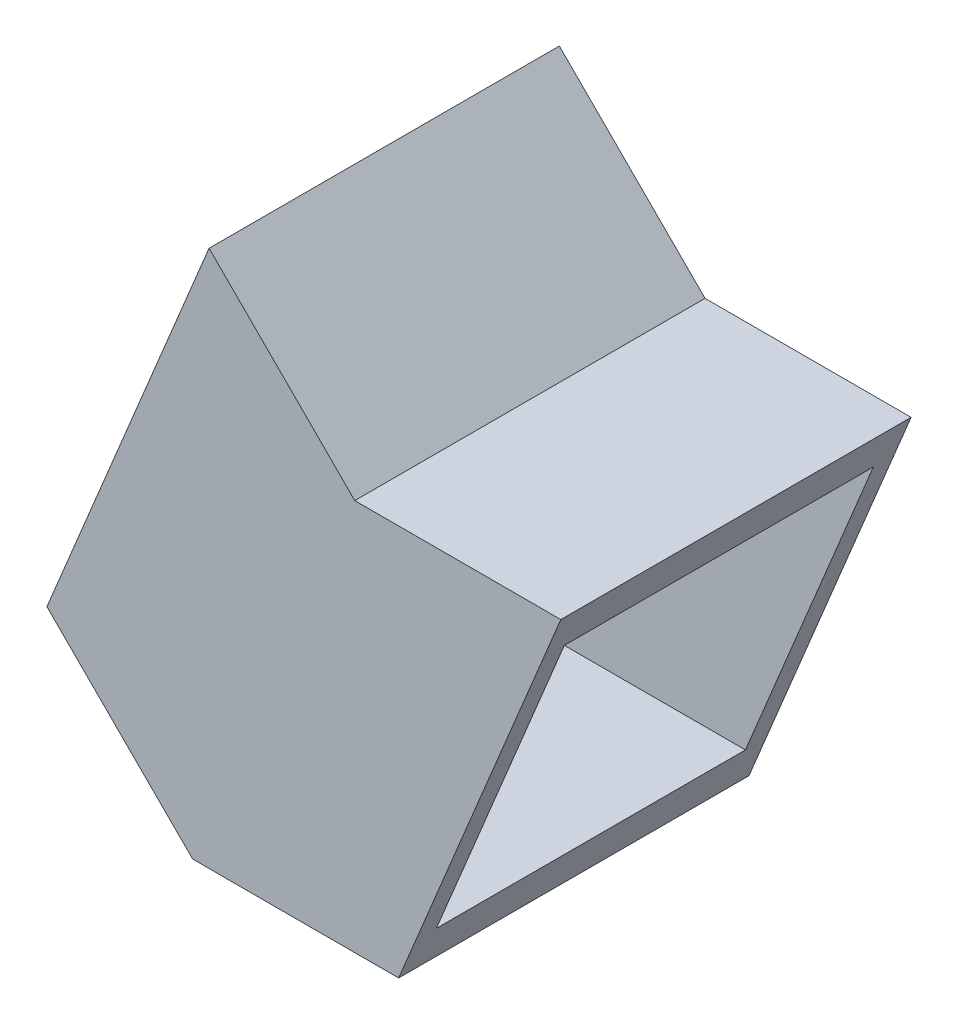
ISO-10303-21;
HEADER;
FILE_DESCRIPTION(('STEP AP214'),'2;1');
FILE_NAME('part.step','',(''),(''),'','','');
FILE_SCHEMA(('AUTOMOTIVE_DESIGN { 1 0 10303 214 1 1 1 1 }'));
ENDSEC;
DATA;
#1=APPLICATION_CONTEXT('core data for automotive mechanical design processes');
#2=APPLICATION_PROTOCOL_DEFINITION('international standard','automotive_design',2000,#1);
#3=PRODUCT_CONTEXT('',#1,'mechanical');
#4=PRODUCT('Part','Part','',(#3));
#5=PRODUCT_RELATED_PRODUCT_CATEGORY('part','',(#4));
#6=PRODUCT_DEFINITION_FORMATION('','',#4);
#7=PRODUCT_DEFINITION_CONTEXT('part definition',#1,'design');
#8=PRODUCT_DEFINITION('design','',#6,#7);
#9=PRODUCT_DEFINITION_SHAPE('','',#8);
#10=(LENGTH_UNIT() NAMED_UNIT(*) SI_UNIT(.MILLI.,.METRE.));
#11=(NAMED_UNIT(*) PLANE_ANGLE_UNIT() SI_UNIT($,.RADIAN.));
#12=(NAMED_UNIT(*) SI_UNIT($,.STERADIAN.) SOLID_ANGLE_UNIT());
#13=UNCERTAINTY_MEASURE_WITH_UNIT(LENGTH_MEASURE(1.E-05),#10,'distance_accuracy_value','');
#14=(GEOMETRIC_REPRESENTATION_CONTEXT(3) GLOBAL_UNCERTAINTY_ASSIGNED_CONTEXT((#13)) GLOBAL_UNIT_ASSIGNED_CONTEXT((#10,
#11,#12)) REPRESENTATION_CONTEXT('',''));
#15=CARTESIAN_POINT('',(0.,0.,0.));
#16=DIRECTION('',(0.,0.,1.));
#17=DIRECTION('',(1.,0.,0.));
#18=AXIS2_PLACEMENT_3D('',#15,#16,#17);
#19=CARTESIAN_POINT('',(-91.9238815542513,-91.9238815542513,34.));
#20=DIRECTION('',(0.707106781186547,0.707106781186547,0.));
#21=DIRECTION('',(-0.707106781186548,0.707106781186548,0.));
#22=AXIS2_PLACEMENT_3D('',#19,#20,#21);
#23=PLANE('',#22);
#24=DIRECTION('',(0.707106781186548,-0.707106781186548,0.));
#25=VECTOR('',#24,1.);
#26=CARTESIAN_POINT('',(-91.9238815542513,-91.9238815542513,2.));
#27=LINE('',#26,#25);
#28=CARTESIAN_POINT('',(-67.9898987322334,-115.857864376269,2.));
#29=VERTEX_POINT('',#28);
#30=CARTESIAN_POINT('',(-53.8477631085024,-130.,2.));
#31=VERTEX_POINT('',#30);
#32=EDGE_CURVE('E238',#29,#31,#27,.T.);
#33=ORIENTED_EDGE('',*,*,#32,.F.);
#34=DIRECTION('',(0.,0.,-1.));
#35=VECTOR('',#34,1.);
#36=CARTESIAN_POINT('',(-67.9898987322334,-115.857864376269,-0.001000000000001));
#37=LINE('',#36,#35);
#38=CARTESIAN_POINT('',(-67.9898987322334,-115.857864376269,32.));
#39=VERTEX_POINT('',#38);
#40=EDGE_CURVE('E222',#39,#29,#37,.T.);
#41=ORIENTED_EDGE('',*,*,#40,.F.);
#42=DIRECTION('',(-0.707106781186548,0.707106781186548,0.));
#43=VECTOR('',#42,1.);
#44=CARTESIAN_POINT('',(-91.9238815542513,-91.9238815542513,32.));
#45=LINE('',#44,#43);
#46=CARTESIAN_POINT('',(-53.8477631085024,-130.,32.));
#47=VERTEX_POINT('',#46);
#48=EDGE_CURVE('E236',#47,#39,#45,.T.);
#49=ORIENTED_EDGE('',*,*,#48,.F.);
#50=DIRECTION('',(0.,0.,-1.));
#51=VECTOR('',#50,1.);
#52=CARTESIAN_POINT('',(-53.8477631085024,-130.,34.));
#53=LINE('',#52,#51);
#54=EDGE_CURVE('E135',#47,#31,#53,.T.);
#55=ORIENTED_EDGE('',*,*,#54,.T.);
#56=EDGE_LOOP('',(#33,#41,#49,#55));
#57=FACE_BOUND('',#56,.T.);
#58=ADVANCED_FACE('F131',(#57),#23,.T.);
#59=CARTESIAN_POINT('',(0.,0.,2.));
#60=DIRECTION('',(0.,0.,1.));
#61=DIRECTION('',(1.,0.,0.));
#62=AXIS2_PLACEMENT_3D('',#59,#60,#61);
#63=PLANE('',#62);
#64=DIRECTION('',(0.707106781186548,-0.707106781186548,0.));
#65=VECTOR('',#64,1.);
#66=CARTESIAN_POINT('',(-70.7106781186548,-70.7106781186548,2.));
#67=LINE('',#66,#65);
#68=CARTESIAN_POINT('',(-55.5634918610405,-85.8578643762691,2.));
#69=VERTEX_POINT('',#68);
#70=CARTESIAN_POINT('',(-41.4213562373096,-100.,2.));
#71=VERTEX_POINT('',#70);
#72=EDGE_CURVE('E270',#69,#71,#67,.T.);
#73=ORIENTED_EDGE('',*,*,#72,.F.);
#74=DIRECTION('',(0.382683432365089,0.923879532511287,0.));
#75=VECTOR('',#74,1.);
#76=CARTESIAN_POINT('',(-17.0710678118656,7.07106781186552,2.));
#77=LINE('',#76,#75);
#78=EDGE_CURVE('E230',#29,#69,#77,.T.);
#79=ORIENTED_EDGE('',*,*,#78,.F.);
#80=ORIENTED_EDGE('',*,*,#32,.T.);
#81=DIRECTION('',(1.,0.,0.));
#82=VECTOR('',#81,1.);
#83=CARTESIAN_POINT('',(0.,-130.,2.));
#84=LINE('',#83,#82);
#85=CARTESIAN_POINT('',(-33.8477631085024,-130.,2.));
#86=VERTEX_POINT('',#85);
#87=EDGE_CURVE('E273',#31,#86,#84,.T.);
#88=ORIENTED_EDGE('',*,*,#87,.T.);
#89=DIRECTION('',(0.382683432365089,0.923879532511287,0.));
#90=VECTOR('',#89,1.);
#91=CARTESIAN_POINT('',(17.0710678118654,-7.07106781186542,2.));
#92=LINE('',#91,#90);
#93=CARTESIAN_POINT('',(-21.4213562373096,-100.,2.));
#94=VERTEX_POINT('',#93);
#95=EDGE_CURVE('E301',#86,#94,#92,.T.);
#96=ORIENTED_EDGE('',*,*,#95,.T.);
#97=DIRECTION('',(1.,0.,0.));
#98=VECTOR('',#97,1.);
#99=CARTESIAN_POINT('',(0.,-100.,2.));
#100=LINE('',#99,#98);
#101=EDGE_CURVE('E265',#71,#94,#100,.T.);
#102=ORIENTED_EDGE('',*,*,#101,.F.);
#103=EDGE_LOOP('',(#73,#79,#80,#88,#96,#102));
#104=FACE_BOUND('',#103,.T.);
#105=ADVANCED_FACE('F315',(#104),#63,.T.);
#106=CARTESIAN_POINT('',(-70.7106781186548,-70.7106781186548,34.));
#107=DIRECTION('',(0.707106781186547,0.707106781186547,0.));
#108=DIRECTION('',(-0.707106781186548,0.707106781186548,0.));
#109=AXIS2_PLACEMENT_3D('',#106,#107,#108);
#110=PLANE('',#109);
#111=DIRECTION('',(0.,0.,-1.));
#112=VECTOR('',#111,1.);
#113=CARTESIAN_POINT('',(-55.5634918610405,-85.8578643762691,-0.001000000000001));
#114=LINE('',#113,#112);
#115=CARTESIAN_POINT('',(-55.5634918610405,-85.8578643762691,32.));
#116=VERTEX_POINT('',#115);
#117=EDGE_CURVE('E225',#116,#69,#114,.T.);
#118=ORIENTED_EDGE('',*,*,#117,.T.);
#119=ORIENTED_EDGE('',*,*,#72,.T.);
#120=DIRECTION('',(0.,0.,-1.));
#121=VECTOR('',#120,1.);
#122=CARTESIAN_POINT('',(-41.4213562373096,-100.,34.));
#123=LINE('',#122,#121);
#124=CARTESIAN_POINT('',(-41.4213562373096,-100.,32.));
#125=VERTEX_POINT('',#124);
#126=EDGE_CURVE('E262',#125,#71,#123,.T.);
#127=ORIENTED_EDGE('',*,*,#126,.F.);
#128=DIRECTION('',(-0.707106781186548,0.707106781186548,0.));
#129=VECTOR('',#128,1.);
#130=CARTESIAN_POINT('',(-70.7106781186548,-70.7106781186548,32.));
#131=LINE('',#130,#129);
#132=EDGE_CURVE('E245',#125,#116,#131,.T.);
#133=ORIENTED_EDGE('',*,*,#132,.T.);
#134=EDGE_LOOP('',(#118,#119,#127,#133));
#135=FACE_BOUND('',#134,.T.);
#136=ADVANCED_FACE('F312',(#135),#110,.F.);
#137=CARTESIAN_POINT('',(0.,0.,32.));
#138=DIRECTION('',(0.,0.,-1.));
#139=DIRECTION('',(-1.,0.,0.));
#140=AXIS2_PLACEMENT_3D('',#137,#138,#139);
#141=PLANE('',#140);
#142=ORIENTED_EDGE('',*,*,#48,.T.);
#143=DIRECTION('',(-0.382683432365089,-0.923879532511287,0.));
#144=VECTOR('',#143,1.);
#145=CARTESIAN_POINT('',(-17.0710678118656,7.07106781186552,32.));
#146=LINE('',#145,#144);
#147=EDGE_CURVE('E219',#116,#39,#146,.T.);
#148=ORIENTED_EDGE('',*,*,#147,.F.);
#149=ORIENTED_EDGE('',*,*,#132,.F.);
#150=DIRECTION('',(-1.,0.,0.));
#151=VECTOR('',#150,1.);
#152=CARTESIAN_POINT('',(0.,-100.,32.));
#153=LINE('',#152,#151);
#154=CARTESIAN_POINT('',(-21.4213562373096,-100.,32.));
#155=VERTEX_POINT('',#154);
#156=EDGE_CURVE('E239',#155,#125,#153,.T.);
#157=ORIENTED_EDGE('',*,*,#156,.F.);
#158=DIRECTION('',(-0.382683432365089,-0.923879532511287,0.));
#159=VECTOR('',#158,1.);
#160=CARTESIAN_POINT('',(17.0710678118654,-7.07106781186542,32.));
#161=LINE('',#160,#159);
#162=CARTESIAN_POINT('',(-33.8477631085024,-130.,32.));
#163=VERTEX_POINT('',#162);
#164=EDGE_CURVE('E319',#155,#163,#161,.T.);
#165=ORIENTED_EDGE('',*,*,#164,.T.);
#166=DIRECTION('',(-1.,0.,0.));
#167=VECTOR('',#166,1.);
#168=CARTESIAN_POINT('',(0.,-130.,32.));
#169=LINE('',#168,#167);
#170=EDGE_CURVE('E244',#163,#47,#169,.T.);
#171=ORIENTED_EDGE('',*,*,#170,.T.);
#172=EDGE_LOOP('',(#142,#148,#149,#157,#165,#171));
#173=FACE_BOUND('',#172,.T.);
#174=ADVANCED_FACE('F241',(#173),#141,.T.);
#175=CARTESIAN_POINT('',(0.,-130.,34.));
#176=DIRECTION('',(0.,1.,0.));
#177=DIRECTION('',(0.,0.,1.));
#178=AXIS2_PLACEMENT_3D('',#175,#176,#177);
#179=PLANE('',#178);
#180=DIRECTION('',(0.,0.,-1.));
#181=VECTOR('',#180,1.);
#182=CARTESIAN_POINT('',(-33.8477631085024,-130.,-0.001000000000001));
#183=LINE('',#182,#181);
#184=EDGE_CURVE('E297',#163,#86,#183,.T.);
#185=ORIENTED_EDGE('',*,*,#184,.T.);
#186=ORIENTED_EDGE('',*,*,#87,.F.);
#187=ORIENTED_EDGE('',*,*,#54,.F.);
#188=ORIENTED_EDGE('',*,*,#170,.F.);
#189=EDGE_LOOP('',(#185,#186,#187,#188));
#190=FACE_BOUND('',#189,.T.);
#191=ADVANCED_FACE('F133',(#190),#179,.T.);
#192=CARTESIAN_POINT('',(0.,-100.,34.));
#193=DIRECTION('',(0.,1.,0.));
#194=DIRECTION('',(-1.,0.,0.));
#195=AXIS2_PLACEMENT_3D('',#192,#193,#194);
#196=PLANE('',#195);
#197=ORIENTED_EDGE('',*,*,#101,.T.);
#198=DIRECTION('',(0.,0.,-1.));
#199=VECTOR('',#198,1.);
#200=CARTESIAN_POINT('',(-21.4213562373096,-100.,-0.001000000000001));
#201=LINE('',#200,#199);
#202=EDGE_CURVE('E310',#155,#94,#201,.T.);
#203=ORIENTED_EDGE('',*,*,#202,.F.);
#204=ORIENTED_EDGE('',*,*,#156,.T.);
#205=ORIENTED_EDGE('',*,*,#126,.T.);
#206=EDGE_LOOP('',(#197,#203,#204,#205));
#207=FACE_BOUND('',#206,.T.);
#208=ADVANCED_FACE('F307',(#207),#196,.F.);
#209=CARTESIAN_POINT('',(17.0710678118654,-7.07106781186542,-0.001000000000001));
#210=DIRECTION('',(-0.923879532511287,0.382683432365089,0.));
#211=DIRECTION('',(-0.382683432365089,-0.923879532511287,0.));
#212=AXIS2_PLACEMENT_3D('',#209,#210,#211);
#213=PLANE('',#212);
#214=ORIENTED_EDGE('',*,*,#164,.F.);
#215=ORIENTED_EDGE('',*,*,#202,.T.);
#216=ORIENTED_EDGE('',*,*,#95,.F.);
#217=ORIENTED_EDGE('',*,*,#184,.F.);
#218=EDGE_LOOP('',(#214,#215,#216,#217));
#219=FACE_BOUND('',#218,.T.);
#220=DIRECTION('',(0.382683432365089,0.923879532511287,0.));
#221=VECTOR('',#220,1.);
#222=CARTESIAN_POINT('',(17.0710678118654,-7.07106781186542,0.));
#223=LINE('',#222,#221);
#224=CARTESIAN_POINT('',(-35.5046173579948,-134.,0.));
#225=VERTEX_POINT('',#224);
#226=CARTESIAN_POINT('',(-19.7645019878172,-96.0000000000001,0.));
#227=VERTEX_POINT('',#226);
#228=EDGE_CURVE('E146',#225,#227,#223,.T.);
#229=ORIENTED_EDGE('',*,*,#228,.T.);
#230=DIRECTION('',(0.,0.,1.));
#231=VECTOR('',#230,1.);
#232=CARTESIAN_POINT('',(-19.7645019878172,-96.0000000000001,-0.001000000000001));
#233=LINE('',#232,#231);
#234=CARTESIAN_POINT('',(-19.7645019878172,-96.0000000000001,34.));
#235=VERTEX_POINT('',#234);
#236=EDGE_CURVE('E324',#227,#235,#233,.T.);
#237=ORIENTED_EDGE('',*,*,#236,.T.);
#238=DIRECTION('',(-0.382683432365089,-0.923879532511287,0.));
#239=VECTOR('',#238,1.);
#240=CARTESIAN_POINT('',(17.0710678118654,-7.07106781186542,34.));
#241=LINE('',#240,#239);
#242=CARTESIAN_POINT('',(-35.5046173579948,-134.,34.));
#243=VERTEX_POINT('',#242);
#244=EDGE_CURVE('E331',#235,#243,#241,.T.);
#245=ORIENTED_EDGE('',*,*,#244,.T.);
#246=DIRECTION('',(0.,0.,1.));
#247=VECTOR('',#246,1.);
#248=CARTESIAN_POINT('',(-35.5046173579948,-134.,-0.001000000000001));
#249=LINE('',#248,#247);
#250=EDGE_CURVE('E290',#225,#243,#249,.T.);
#251=ORIENTED_EDGE('',*,*,#250,.F.);
#252=EDGE_LOOP('',(#229,#237,#245,#251));
#253=FACE_BOUND('',#252,.T.);
#254=ADVANCED_FACE('F345',(#219,#253),#213,.F.);
#255=CARTESIAN_POINT('',(-17.0710678118656,7.07106781186552,-0.001000000000001));
#256=DIRECTION('',(-0.923879532511287,0.382683432365089,0.));
#257=DIRECTION('',(-0.382683432365089,-0.923879532511287,0.));
#258=AXIS2_PLACEMENT_3D('',#255,#256,#257);
#259=PLANE('',#258);
#260=ORIENTED_EDGE('',*,*,#40,.T.);
#261=ORIENTED_EDGE('',*,*,#78,.T.);
#262=ORIENTED_EDGE('',*,*,#117,.F.);
#263=ORIENTED_EDGE('',*,*,#147,.T.);
#264=EDGE_LOOP('',(#260,#261,#262,#263));
#265=FACE_BOUND('',#264,.T.);
#266=DIRECTION('',(0.,0.,1.));
#267=VECTOR('',#266,1.);
#268=CARTESIAN_POINT('',(-69.6467529817257,-119.857864376269,-0.001000000000001));
#269=LINE('',#268,#267);
#270=CARTESIAN_POINT('',(-69.6467529817257,-119.857864376269,0.));
#271=VERTEX_POINT('',#270);
#272=CARTESIAN_POINT('',(-69.6467529817257,-119.857864376269,34.));
#273=VERTEX_POINT('',#272);
#274=EDGE_CURVE('E327',#271,#273,#269,.T.);
#275=ORIENTED_EDGE('',*,*,#274,.T.);
#276=DIRECTION('',(-0.382683432365089,-0.923879532511287,0.));
#277=VECTOR('',#276,1.);
#278=CARTESIAN_POINT('',(-17.0710678118656,7.07106781186552,34.));
#279=LINE('',#278,#277);
#280=CARTESIAN_POINT('',(-53.9066376115481,-81.8578643762691,34.));
#281=VERTEX_POINT('',#280);
#282=EDGE_CURVE('E154',#281,#273,#279,.T.);
#283=ORIENTED_EDGE('',*,*,#282,.F.);
#284=DIRECTION('',(0.,0.,1.));
#285=VECTOR('',#284,1.);
#286=CARTESIAN_POINT('',(-53.9066376115481,-81.8578643762691,-0.001000000000001));
#287=LINE('',#286,#285);
#288=CARTESIAN_POINT('',(-53.9066376115481,-81.8578643762691,0.));
#289=VERTEX_POINT('',#288);
#290=EDGE_CURVE('E323',#289,#281,#287,.T.);
#291=ORIENTED_EDGE('',*,*,#290,.F.);
#292=DIRECTION('',(0.382683432365089,0.923879532511287,0.));
#293=VECTOR('',#292,1.);
#294=CARTESIAN_POINT('',(-17.0710678118656,7.07106781186552,0.));
#295=LINE('',#294,#293);
#296=EDGE_CURVE('E333',#271,#289,#295,.T.);
#297=ORIENTED_EDGE('',*,*,#296,.F.);
#298=EDGE_LOOP('',(#275,#283,#291,#297));
#299=FACE_BOUND('',#298,.T.);
#300=ADVANCED_FACE('F221',(#265,#299),#259,.T.);
#301=CARTESIAN_POINT('',(-94.7523086789975,-94.7523086789975,34.));
#302=DIRECTION('',(0.707106781186547,0.707106781186548,0.));
#303=DIRECTION('',(-0.707106781186548,0.707106781186547,0.));
#304=AXIS2_PLACEMENT_3D('',#301,#302,#303);
#305=PLANE('',#304);
#306=ORIENTED_EDGE('',*,*,#274,.F.);
#307=DIRECTION('',(0.707106781186548,-0.707106781186547,0.));
#308=VECTOR('',#307,1.);
#309=CARTESIAN_POINT('',(-94.7523086789975,-94.7523086789975,0.));
#310=LINE('',#309,#308);
#311=CARTESIAN_POINT('',(-55.5046173579948,-134.,0.));
#312=VERTEX_POINT('',#311);
#313=EDGE_CURVE('E276',#271,#312,#310,.T.);
#314=ORIENTED_EDGE('',*,*,#313,.T.);
#315=DIRECTION('',(0.,0.,-1.));
#316=VECTOR('',#315,1.);
#317=CARTESIAN_POINT('',(-55.5046173579948,-134.,34.));
#318=LINE('',#317,#316);
#319=CARTESIAN_POINT('',(-55.5046173579948,-134.,34.));
#320=VERTEX_POINT('',#319);
#321=EDGE_CURVE('E12',#320,#312,#318,.T.);
#322=ORIENTED_EDGE('',*,*,#321,.F.);
#323=DIRECTION('',(0.707106781186548,-0.707106781186547,0.));
#324=VECTOR('',#323,1.);
#325=CARTESIAN_POINT('',(-94.7523086789975,-94.7523086789975,34.));
#326=LINE('',#325,#324);
#327=EDGE_CURVE('E277',#273,#320,#326,.T.);
#328=ORIENTED_EDGE('',*,*,#327,.F.);
#329=EDGE_LOOP('',(#306,#314,#322,#328));
#330=FACE_BOUND('',#329,.T.);
#331=ADVANCED_FACE('F350',(#330),#305,.F.);
#332=CARTESIAN_POINT('',(0.,0.,34.));
#333=DIRECTION('',(0.,0.,1.));
#334=DIRECTION('',(1.,0.,0.));
#335=AXIS2_PLACEMENT_3D('',#332,#333,#334);
#336=PLANE('',#335);
#337=DIRECTION('',(0.707106781186548,-0.707106781186548,0.));
#338=VECTOR('',#337,1.);
#339=CARTESIAN_POINT('',(-67.8822509939086,-67.8822509939086,34.));
#340=LINE('',#339,#338);
#341=CARTESIAN_POINT('',(-39.7645019878172,-96.,34.));
#342=VERTEX_POINT('',#341);
#343=EDGE_CURVE('E255',#281,#342,#340,.T.);
#344=ORIENTED_EDGE('',*,*,#343,.F.);
#345=ORIENTED_EDGE('',*,*,#282,.T.);
#346=ORIENTED_EDGE('',*,*,#327,.T.);
#347=DIRECTION('',(1.,0.,0.));
#348=VECTOR('',#347,1.);
#349=CARTESIAN_POINT('',(0.,-134.,34.));
#350=LINE('',#349,#348);
#351=EDGE_CURVE('E279',#320,#243,#350,.T.);
#352=ORIENTED_EDGE('',*,*,#351,.T.);
#353=ORIENTED_EDGE('',*,*,#244,.F.);
#354=DIRECTION('',(1.,0.,0.));
#355=VECTOR('',#354,1.);
#356=CARTESIAN_POINT('',(0.,-96.0000000000001,34.));
#357=LINE('',#356,#355);
#358=EDGE_CURVE('E252',#342,#235,#357,.T.);
#359=ORIENTED_EDGE('',*,*,#358,.F.);
#360=EDGE_LOOP('',(#344,#345,#346,#352,#353,#359));
#361=FACE_BOUND('',#360,.T.);
#362=ADVANCED_FACE('F347',(#361),#336,.T.);
#363=CARTESIAN_POINT('',(0.,0.,0.));
#364=DIRECTION('',(0.,0.,1.));
#365=DIRECTION('',(1.,0.,0.));
#366=AXIS2_PLACEMENT_3D('',#363,#364,#365);
#367=PLANE('',#366);
#368=ORIENTED_EDGE('',*,*,#296,.T.);
#369=DIRECTION('',(0.707106781186548,-0.707106781186548,0.));
#370=VECTOR('',#369,1.);
#371=CARTESIAN_POINT('',(-67.8822509939086,-67.8822509939086,0.));
#372=LINE('',#371,#370);
#373=CARTESIAN_POINT('',(-39.7645019878172,-96.,0.));
#374=VERTEX_POINT('',#373);
#375=EDGE_CURVE('E256',#289,#374,#372,.T.);
#376=ORIENTED_EDGE('',*,*,#375,.T.);
#377=DIRECTION('',(1.,0.,0.));
#378=VECTOR('',#377,1.);
#379=CARTESIAN_POINT('',(0.,-96.0000000000001,0.));
#380=LINE('',#379,#378);
#381=EDGE_CURVE('E247',#374,#227,#380,.T.);
#382=ORIENTED_EDGE('',*,*,#381,.T.);
#383=ORIENTED_EDGE('',*,*,#228,.F.);
#384=DIRECTION('',(1.,0.,0.));
#385=VECTOR('',#384,1.);
#386=CARTESIAN_POINT('',(0.,-134.,0.));
#387=LINE('',#386,#385);
#388=EDGE_CURVE('E280',#312,#225,#387,.T.);
#389=ORIENTED_EDGE('',*,*,#388,.F.);
#390=ORIENTED_EDGE('',*,*,#313,.F.);
#391=EDGE_LOOP('',(#368,#376,#382,#383,#389,#390));
#392=FACE_BOUND('',#391,.T.);
#393=ADVANCED_FACE('F295',(#392),#367,.F.);
#394=CARTESIAN_POINT('',(-67.8822509939086,-67.8822509939086,34.));
#395=DIRECTION('',(0.707106781186547,0.707106781186547,0.));
#396=DIRECTION('',(-0.707106781186548,0.707106781186548,0.));
#397=AXIS2_PLACEMENT_3D('',#394,#395,#396);
#398=PLANE('',#397);
#399=ORIENTED_EDGE('',*,*,#375,.F.);
#400=ORIENTED_EDGE('',*,*,#290,.T.);
#401=ORIENTED_EDGE('',*,*,#343,.T.);
#402=DIRECTION('',(0.,0.,-1.));
#403=VECTOR('',#402,1.);
#404=CARTESIAN_POINT('',(-39.7645019878172,-96.,34.));
#405=LINE('',#404,#403);
#406=EDGE_CURVE('E258',#342,#374,#405,.T.);
#407=ORIENTED_EDGE('',*,*,#406,.T.);
#408=EDGE_LOOP('',(#399,#400,#401,#407));
#409=FACE_BOUND('',#408,.T.);
#410=ADVANCED_FACE('F338',(#409),#398,.T.);
#411=CARTESIAN_POINT('',(0.,-134.,34.));
#412=DIRECTION('',(0.,1.,0.));
#413=DIRECTION('',(0.,0.,1.));
#414=AXIS2_PLACEMENT_3D('',#411,#412,#413);
#415=PLANE('',#414);
#416=ORIENTED_EDGE('',*,*,#388,.T.);
#417=ORIENTED_EDGE('',*,*,#250,.T.);
#418=ORIENTED_EDGE('',*,*,#351,.F.);
#419=ORIENTED_EDGE('',*,*,#321,.T.);
#420=EDGE_LOOP('',(#416,#417,#418,#419));
#421=FACE_BOUND('',#420,.T.);
#422=ADVANCED_FACE('F288',(#421),#415,.F.);
#423=CARTESIAN_POINT('',(0.,-96.0000000000001,34.));
#424=DIRECTION('',(0.,1.,0.));
#425=DIRECTION('',(0.,0.,1.));
#426=AXIS2_PLACEMENT_3D('',#423,#424,#425);
#427=PLANE('',#426);
#428=ORIENTED_EDGE('',*,*,#236,.F.);
#429=ORIENTED_EDGE('',*,*,#381,.F.);
#430=ORIENTED_EDGE('',*,*,#406,.F.);
#431=ORIENTED_EDGE('',*,*,#358,.T.);
#432=EDGE_LOOP('',(#428,#429,#430,#431));
#433=FACE_BOUND('',#432,.T.);
#434=ADVANCED_FACE('F343',(#433),#427,.T.);
#435=CLOSED_SHELL('',(#58,#105,#136,#174,#191,#208,#254,#300,#331,#362,#393,#410,#422,#434));
#436=MANIFOLD_SOLID_BREP('B2',#435);
#437=ADVANCED_BREP_SHAPE_REPRESENTATION('',(#18,#436),#14);
#438=SHAPE_DEFINITION_REPRESENTATION(#9,#437);
ENDSEC;
END-ISO-10303-21;
